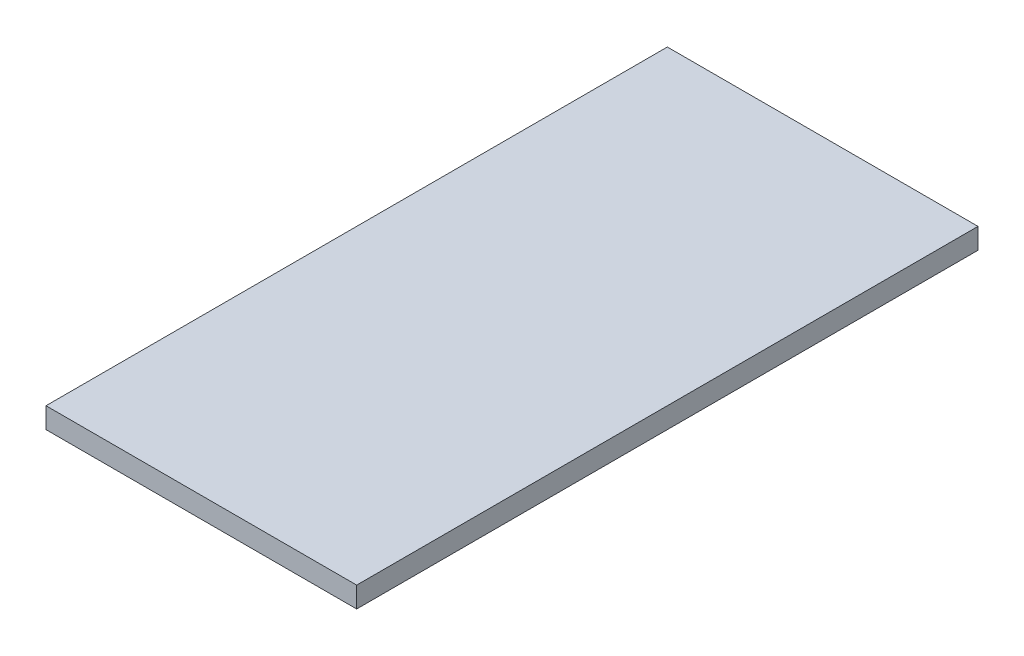
ISO-10303-21;
HEADER;
FILE_DESCRIPTION(('STEP AP214'),'2;1');
FILE_NAME('part.step','',(''),(''),'','','');
FILE_SCHEMA(('AUTOMOTIVE_DESIGN { 1 0 10303 214 1 1 1 1 }'));
ENDSEC;
DATA;
#1=APPLICATION_CONTEXT('core data for automotive mechanical design processes');
#2=APPLICATION_PROTOCOL_DEFINITION('international standard','automotive_design',2000,#1);
#3=PRODUCT_CONTEXT('',#1,'mechanical');
#4=PRODUCT('Part','Part','',(#3));
#5=PRODUCT_RELATED_PRODUCT_CATEGORY('part','',(#4));
#6=PRODUCT_DEFINITION_FORMATION('','',#4);
#7=PRODUCT_DEFINITION_CONTEXT('part definition',#1,'design');
#8=PRODUCT_DEFINITION('design','',#6,#7);
#9=PRODUCT_DEFINITION_SHAPE('','',#8);
#10=(LENGTH_UNIT() NAMED_UNIT(*) SI_UNIT(.MILLI.,.METRE.));
#11=(NAMED_UNIT(*) PLANE_ANGLE_UNIT() SI_UNIT($,.RADIAN.));
#12=(NAMED_UNIT(*) SI_UNIT($,.STERADIAN.) SOLID_ANGLE_UNIT());
#13=UNCERTAINTY_MEASURE_WITH_UNIT(LENGTH_MEASURE(1.E-05),#10,'distance_accuracy_value','');
#14=(GEOMETRIC_REPRESENTATION_CONTEXT(3) GLOBAL_UNCERTAINTY_ASSIGNED_CONTEXT((#13)) GLOBAL_UNIT_ASSIGNED_CONTEXT((#10,
#11,#12)) REPRESENTATION_CONTEXT('',''));
#15=CARTESIAN_POINT('',(0.,0.,0.));
#16=DIRECTION('',(0.,0.,1.));
#17=DIRECTION('',(1.,0.,0.));
#18=AXIS2_PLACEMENT_3D('',#15,#16,#17);
#19=CARTESIAN_POINT('',(-75.,10.,150.));
#20=DIRECTION('',(1.,0.,0.));
#21=DIRECTION('',(0.,0.,-1.));
#22=AXIS2_PLACEMENT_3D('',#19,#20,#21);
#23=PLANE('',#22);
#24=DIRECTION('',(0.,0.,1.));
#25=VECTOR('',#24,1.);
#26=CARTESIAN_POINT('',(-75.,0.,150.));
#27=LINE('',#26,#25);
#28=CARTESIAN_POINT('',(-75.,0.,-150.));
#29=VERTEX_POINT('',#28);
#30=CARTESIAN_POINT('',(-75.,0.,150.));
#31=VERTEX_POINT('',#30);
#32=EDGE_CURVE('E96',#29,#31,#27,.T.);
#33=ORIENTED_EDGE('',*,*,#32,.T.);
#34=DIRECTION('',(0.,-1.,0.));
#35=VECTOR('',#34,1.);
#36=CARTESIAN_POINT('',(-75.,10.,150.));
#37=LINE('',#36,#35);
#38=CARTESIAN_POINT('',(-75.,10.,150.));
#39=VERTEX_POINT('',#38);
#40=EDGE_CURVE('E11',#39,#31,#37,.T.);
#41=ORIENTED_EDGE('',*,*,#40,.F.);
#42=DIRECTION('',(0.,0.,1.));
#43=VECTOR('',#42,1.);
#44=CARTESIAN_POINT('',(-75.,10.,150.));
#45=LINE('',#44,#43);
#46=CARTESIAN_POINT('',(-75.,10.,-150.));
#47=VERTEX_POINT('',#46);
#48=EDGE_CURVE('E84',#47,#39,#45,.T.);
#49=ORIENTED_EDGE('',*,*,#48,.F.);
#50=DIRECTION('',(0.,-1.,0.));
#51=VECTOR('',#50,1.);
#52=CARTESIAN_POINT('',(-75.,10.,-150.));
#53=LINE('',#52,#51);
#54=EDGE_CURVE('E92',#47,#29,#53,.T.);
#55=ORIENTED_EDGE('',*,*,#54,.T.);
#56=EDGE_LOOP('',(#33,#41,#49,#55));
#57=FACE_BOUND('',#56,.T.);
#58=ADVANCED_FACE('F33',(#57),#23,.F.);
#59=CARTESIAN_POINT('',(75.,10.,150.));
#60=DIRECTION('',(0.,0.,-1.));
#61=DIRECTION('',(-1.,0.,0.));
#62=AXIS2_PLACEMENT_3D('',#59,#60,#61);
#63=PLANE('',#62);
#64=DIRECTION('',(1.,0.,0.));
#65=VECTOR('',#64,1.);
#66=CARTESIAN_POINT('',(75.,0.,150.));
#67=LINE('',#66,#65);
#68=CARTESIAN_POINT('',(75.,0.,150.));
#69=VERTEX_POINT('',#68);
#70=EDGE_CURVE('E88',#31,#69,#67,.T.);
#71=ORIENTED_EDGE('',*,*,#70,.T.);
#72=DIRECTION('',(0.,-1.,0.));
#73=VECTOR('',#72,1.);
#74=CARTESIAN_POINT('',(75.,10.,150.));
#75=LINE('',#74,#73);
#76=CARTESIAN_POINT('',(75.,10.,150.));
#77=VERTEX_POINT('',#76);
#78=EDGE_CURVE('E41',#77,#69,#75,.T.);
#79=ORIENTED_EDGE('',*,*,#78,.F.);
#80=DIRECTION('',(1.,0.,0.));
#81=VECTOR('',#80,1.);
#82=CARTESIAN_POINT('',(75.,10.,150.));
#83=LINE('',#82,#81);
#84=EDGE_CURVE('E79',#39,#77,#83,.T.);
#85=ORIENTED_EDGE('',*,*,#84,.F.);
#86=ORIENTED_EDGE('',*,*,#40,.T.);
#87=EDGE_LOOP('',(#71,#79,#85,#86));
#88=FACE_BOUND('',#87,.T.);
#89=ADVANCED_FACE('F87',(#88),#63,.F.);
#90=CARTESIAN_POINT('',(75.,10.,150.));
#91=DIRECTION('',(-1.,0.,0.));
#92=DIRECTION('',(0.,0.,1.));
#93=AXIS2_PLACEMENT_3D('',#90,#91,#92);
#94=PLANE('',#93);
#95=DIRECTION('',(0.,0.,-1.));
#96=VECTOR('',#95,1.);
#97=CARTESIAN_POINT('',(75.,0.,150.));
#98=LINE('',#97,#96);
#99=CARTESIAN_POINT('',(75.,0.,-150.));
#100=VERTEX_POINT('',#99);
#101=EDGE_CURVE('E66',#69,#100,#98,.T.);
#102=ORIENTED_EDGE('',*,*,#101,.T.);
#103=DIRECTION('',(0.,-1.,0.));
#104=VECTOR('',#103,1.);
#105=CARTESIAN_POINT('',(75.,10.,-150.));
#106=LINE('',#105,#104);
#107=CARTESIAN_POINT('',(75.,10.,-150.));
#108=VERTEX_POINT('',#107);
#109=EDGE_CURVE('E89',#108,#100,#106,.T.);
#110=ORIENTED_EDGE('',*,*,#109,.F.);
#111=DIRECTION('',(0.,0.,-1.));
#112=VECTOR('',#111,1.);
#113=CARTESIAN_POINT('',(75.,10.,150.));
#114=LINE('',#113,#112);
#115=EDGE_CURVE('E82',#77,#108,#114,.T.);
#116=ORIENTED_EDGE('',*,*,#115,.F.);
#117=ORIENTED_EDGE('',*,*,#78,.T.);
#118=EDGE_LOOP('',(#102,#110,#116,#117));
#119=FACE_BOUND('',#118,.T.);
#120=ADVANCED_FACE('F90',(#119),#94,.F.);
#121=CARTESIAN_POINT('',(75.,10.,-150.));
#122=DIRECTION('',(0.,0.,1.));
#123=DIRECTION('',(1.,0.,0.));
#124=AXIS2_PLACEMENT_3D('',#121,#122,#123);
#125=PLANE('',#124);
#126=DIRECTION('',(-1.,0.,0.));
#127=VECTOR('',#126,1.);
#128=CARTESIAN_POINT('',(75.,0.,-150.));
#129=LINE('',#128,#127);
#130=EDGE_CURVE('E72',#100,#29,#129,.T.);
#131=ORIENTED_EDGE('',*,*,#130,.T.);
#132=ORIENTED_EDGE('',*,*,#54,.F.);
#133=DIRECTION('',(-1.,0.,0.));
#134=VECTOR('',#133,1.);
#135=CARTESIAN_POINT('',(75.,10.,-150.));
#136=LINE('',#135,#134);
#137=EDGE_CURVE('E49',#108,#47,#136,.T.);
#138=ORIENTED_EDGE('',*,*,#137,.F.);
#139=ORIENTED_EDGE('',*,*,#109,.T.);
#140=EDGE_LOOP('',(#131,#132,#138,#139));
#141=FACE_BOUND('',#140,.T.);
#142=ADVANCED_FACE('F103',(#141),#125,.F.);
#143=CARTESIAN_POINT('',(0.,10.,0.));
#144=DIRECTION('',(0.,1.,0.));
#145=DIRECTION('',(0.,0.,1.));
#146=AXIS2_PLACEMENT_3D('',#143,#144,#145);
#147=PLANE('',#146);
#148=ORIENTED_EDGE('',*,*,#48,.T.);
#149=ORIENTED_EDGE('',*,*,#84,.T.);
#150=ORIENTED_EDGE('',*,*,#115,.T.);
#151=ORIENTED_EDGE('',*,*,#137,.T.);
#152=EDGE_LOOP('',(#148,#149,#150,#151));
#153=FACE_BOUND('',#152,.T.);
#154=ADVANCED_FACE('F80',(#153),#147,.T.);
#155=CARTESIAN_POINT('',(0.,0.,0.));
#156=DIRECTION('',(0.,1.,0.));
#157=DIRECTION('',(0.,0.,1.));
#158=AXIS2_PLACEMENT_3D('',#155,#156,#157);
#159=PLANE('',#158);
#160=ORIENTED_EDGE('',*,*,#32,.F.);
#161=ORIENTED_EDGE('',*,*,#130,.F.);
#162=ORIENTED_EDGE('',*,*,#101,.F.);
#163=ORIENTED_EDGE('',*,*,#70,.F.);
#164=EDGE_LOOP('',(#160,#161,#162,#163));
#165=FACE_BOUND('',#164,.T.);
#166=ADVANCED_FACE('F106',(#165),#159,.F.);
#167=CLOSED_SHELL('',(#58,#89,#120,#142,#154,#166));
#168=MANIFOLD_SOLID_BREP('B2',#167);
#169=ADVANCED_BREP_SHAPE_REPRESENTATION('',(#18,#168),#14);
#170=SHAPE_DEFINITION_REPRESENTATION(#9,#169);
ENDSEC;
END-ISO-10303-21;
